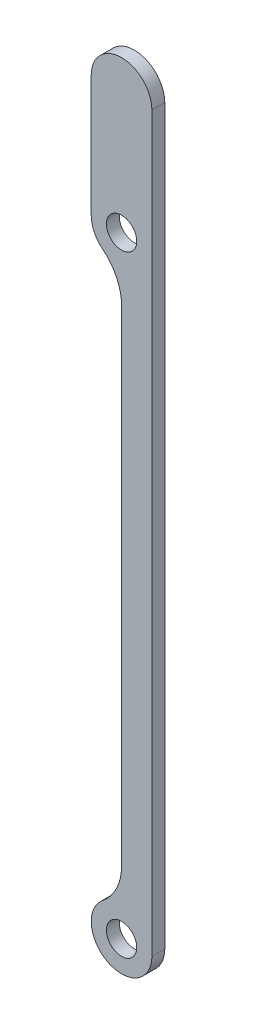
ISO-10303-21;
HEADER;
FILE_DESCRIPTION(('STEP AP214'),'2;1');
FILE_NAME('part.step','',(''),(''),'','','');
FILE_SCHEMA(('AUTOMOTIVE_DESIGN { 1 0 10303 214 1 1 1 1 }'));
ENDSEC;
DATA;
#1=APPLICATION_CONTEXT('core data for automotive mechanical design processes');
#2=APPLICATION_PROTOCOL_DEFINITION('international standard','automotive_design',2000,#1);
#3=PRODUCT_CONTEXT('',#1,'mechanical');
#4=PRODUCT('Part','Part','',(#3));
#5=PRODUCT_RELATED_PRODUCT_CATEGORY('part','',(#4));
#6=PRODUCT_DEFINITION_FORMATION('','',#4);
#7=PRODUCT_DEFINITION_CONTEXT('part definition',#1,'design');
#8=PRODUCT_DEFINITION('design','',#6,#7);
#9=PRODUCT_DEFINITION_SHAPE('','',#8);
#10=(LENGTH_UNIT() NAMED_UNIT(*) SI_UNIT(.MILLI.,.METRE.));
#11=(NAMED_UNIT(*) PLANE_ANGLE_UNIT() SI_UNIT($,.RADIAN.));
#12=(NAMED_UNIT(*) SI_UNIT($,.STERADIAN.) SOLID_ANGLE_UNIT());
#13=UNCERTAINTY_MEASURE_WITH_UNIT(LENGTH_MEASURE(1.E-05),#10,'distance_accuracy_value','');
#14=(GEOMETRIC_REPRESENTATION_CONTEXT(3) GLOBAL_UNCERTAINTY_ASSIGNED_CONTEXT((#13)) GLOBAL_UNIT_ASSIGNED_CONTEXT((#10,
#11,#12)) REPRESENTATION_CONTEXT('',''));
#15=CARTESIAN_POINT('',(0.,0.,0.));
#16=DIRECTION('',(0.,0.,1.));
#17=DIRECTION('',(1.,0.,0.));
#18=AXIS2_PLACEMENT_3D('',#15,#16,#17);
#19=CARTESIAN_POINT('',(-10.,12.4899959967968,2.55));
#20=DIRECTION('',(0.,0.,-1.));
#21=DIRECTION('',(-1.,0.,0.));
#22=AXIS2_PLACEMENT_3D('',#19,#20,#21);
#23=PLANE('',#22);
#24=CARTESIAN_POINT('',(0.,0.,2.55));
#25=DIRECTION('',(0.,0.,1.));
#26=DIRECTION('',(1.,0.,0.));
#27=AXIS2_PLACEMENT_3D('',#24,#25,#26);
#28=CIRCLE('',#27,3.);
#29=CARTESIAN_POINT('',(3.,0.,2.55));
#30=VERTEX_POINT('',#29);
#31=EDGE_CURVE('E136',#30,#30,#28,.T.);
#32=ORIENTED_EDGE('',*,*,#31,.F.);
#33=EDGE_LOOP('',(#32));
#34=FACE_BOUND('',#33,.T.);
#35=CARTESIAN_POINT('',(-10.,12.4899959967968,2.55));
#36=DIRECTION('',(0.,0.,-1.));
#37=DIRECTION('',(-1.,0.,0.));
#38=AXIS2_PLACEMENT_3D('',#35,#36,#37);
#39=CIRCLE('',#38,10.);
#40=CARTESIAN_POINT('',(0.,12.4899959967968,2.55));
#41=VERTEX_POINT('',#40);
#42=CARTESIAN_POINT('',(-3.75,4.6837484987988,2.55));
#43=VERTEX_POINT('',#42);
#44=EDGE_CURVE('E148',#41,#43,#39,.T.);
#45=ORIENTED_EDGE('',*,*,#44,.T.);
#46=CARTESIAN_POINT('',(0.,0.,2.55));
#47=DIRECTION('',(0.,0.,1.));
#48=DIRECTION('',(1.,0.,0.));
#49=AXIS2_PLACEMENT_3D('',#46,#47,#48);
#50=CIRCLE('',#49,6.);
#51=CARTESIAN_POINT('',(6.,0.,2.55));
#52=VERTEX_POINT('',#51);
#53=EDGE_CURVE('E95',#43,#52,#50,.T.);
#54=ORIENTED_EDGE('',*,*,#53,.T.);
#55=DIRECTION('',(0.,1.,0.));
#56=VECTOR('',#55,1.);
#57=CARTESIAN_POINT('',(5.99999999999998,120.,2.55));
#58=LINE('',#57,#56);
#59=CARTESIAN_POINT('',(5.99999999999998,145.,2.55));
#60=VERTEX_POINT('',#59);
#61=EDGE_CURVE('E162',#52,#60,#58,.T.);
#62=ORIENTED_EDGE('',*,*,#61,.T.);
#63=CARTESIAN_POINT('',(0.,145.,2.55));
#64=DIRECTION('',(0.,0.,1.));
#65=DIRECTION('',(1.,0.,0.));
#66=AXIS2_PLACEMENT_3D('',#63,#64,#65);
#67=CIRCLE('',#66,6.);
#68=CARTESIAN_POINT('',(-6.00000000000001,145.,2.55));
#69=VERTEX_POINT('',#68);
#70=EDGE_CURVE('E177',#60,#69,#67,.T.);
#71=ORIENTED_EDGE('',*,*,#70,.T.);
#72=DIRECTION('',(0.,-1.,0.));
#73=VECTOR('',#72,1.);
#74=CARTESIAN_POINT('',(-6.00000000000001,145.,2.55));
#75=LINE('',#74,#73);
#76=CARTESIAN_POINT('',(-6.00000000000001,121.,2.55));
#77=VERTEX_POINT('',#76);
#78=EDGE_CURVE('E114',#69,#77,#75,.T.);
#79=ORIENTED_EDGE('',*,*,#78,.T.);
#80=CARTESIAN_POINT('',(0.,121.,2.55));
#81=DIRECTION('',(0.,0.,1.));
#82=DIRECTION('',(1.,0.,0.));
#83=AXIS2_PLACEMENT_3D('',#80,#81,#82);
#84=CIRCLE('',#83,5.99999999999999);
#85=CARTESIAN_POINT('',(-3.75000000000001,116.316251501201,2.55));
#86=VERTEX_POINT('',#85);
#87=EDGE_CURVE('E108',#77,#86,#84,.T.);
#88=ORIENTED_EDGE('',*,*,#87,.T.);
#89=CARTESIAN_POINT('',(-10.,108.510004003203,2.55));
#90=DIRECTION('',(0.,0.,-1.));
#91=DIRECTION('',(-1.,0.,0.));
#92=AXIS2_PLACEMENT_3D('',#89,#90,#91);
#93=CIRCLE('',#92,10.);
#94=CARTESIAN_POINT('',(0.,108.510004003203,2.55));
#95=VERTEX_POINT('',#94);
#96=EDGE_CURVE('E112',#86,#95,#93,.T.);
#97=ORIENTED_EDGE('',*,*,#96,.T.);
#98=DIRECTION('',(0.,-1.,0.));
#99=VECTOR('',#98,1.);
#100=CARTESIAN_POINT('',(0.,12.4899959967968,2.55));
#101=LINE('',#100,#99);
#102=EDGE_CURVE('E52',#95,#41,#101,.T.);
#103=ORIENTED_EDGE('',*,*,#102,.T.);
#104=EDGE_LOOP('',(#45,#54,#62,#71,#79,#88,#97,#103));
#105=FACE_BOUND('',#104,.T.);
#106=CARTESIAN_POINT('',(0.,121.,2.55));
#107=DIRECTION('',(0.,0.,1.));
#108=DIRECTION('',(1.,0.,0.));
#109=AXIS2_PLACEMENT_3D('',#106,#107,#108);
#110=CIRCLE('',#109,3.);
#111=CARTESIAN_POINT('',(2.99999999999999,121.,2.55));
#112=VERTEX_POINT('',#111);
#113=EDGE_CURVE('E186',#112,#112,#110,.T.);
#114=ORIENTED_EDGE('',*,*,#113,.F.);
#115=EDGE_LOOP('',(#114));
#116=FACE_BOUND('',#115,.T.);
#117=ADVANCED_FACE('F35',(#34,#105,#116),#23,.F.);
#118=CARTESIAN_POINT('',(-10.,12.4899959967968,0.));
#119=DIRECTION('',(0.,0.,-1.));
#120=DIRECTION('',(-1.,0.,0.));
#121=AXIS2_PLACEMENT_3D('',#118,#119,#120);
#122=PLANE('',#121);
#123=CARTESIAN_POINT('',(0.,0.,0.));
#124=DIRECTION('',(0.,0.,1.));
#125=DIRECTION('',(1.,0.,0.));
#126=AXIS2_PLACEMENT_3D('',#123,#124,#125);
#127=CIRCLE('',#126,3.);
#128=CARTESIAN_POINT('',(3.,0.,0.));
#129=VERTEX_POINT('',#128);
#130=EDGE_CURVE('E183',#129,#129,#127,.T.);
#131=ORIENTED_EDGE('',*,*,#130,.T.);
#132=EDGE_LOOP('',(#131));
#133=FACE_BOUND('',#132,.T.);
#134=CARTESIAN_POINT('',(-10.,12.4899959967968,0.));
#135=DIRECTION('',(0.,0.,-1.));
#136=DIRECTION('',(-1.,0.,0.));
#137=AXIS2_PLACEMENT_3D('',#134,#135,#136);
#138=CIRCLE('',#137,10.);
#139=CARTESIAN_POINT('',(0.,12.4899959967968,0.));
#140=VERTEX_POINT('',#139);
#141=CARTESIAN_POINT('',(-3.75,4.6837484987988,0.));
#142=VERTEX_POINT('',#141);
#143=EDGE_CURVE('E132',#140,#142,#138,.T.);
#144=ORIENTED_EDGE('',*,*,#143,.F.);
#145=DIRECTION('',(0.,-1.,0.));
#146=VECTOR('',#145,1.);
#147=CARTESIAN_POINT('',(0.,12.4899959967968,0.));
#148=LINE('',#147,#146);
#149=CARTESIAN_POINT('',(0.,108.510004003203,0.));
#150=VERTEX_POINT('',#149);
#151=EDGE_CURVE('E87',#150,#140,#148,.T.);
#152=ORIENTED_EDGE('',*,*,#151,.F.);
#153=CARTESIAN_POINT('',(-10.,108.510004003203,0.));
#154=DIRECTION('',(0.,0.,-1.));
#155=DIRECTION('',(-1.,0.,0.));
#156=AXIS2_PLACEMENT_3D('',#153,#154,#155);
#157=CIRCLE('',#156,10.);
#158=CARTESIAN_POINT('',(-3.75000000000001,116.316251501201,0.));
#159=VERTEX_POINT('',#158);
#160=EDGE_CURVE('E81',#159,#150,#157,.T.);
#161=ORIENTED_EDGE('',*,*,#160,.F.);
#162=CARTESIAN_POINT('',(0.,121.,0.));
#163=DIRECTION('',(0.,0.,1.));
#164=DIRECTION('',(1.,0.,0.));
#165=AXIS2_PLACEMENT_3D('',#162,#163,#164);
#166=CIRCLE('',#165,5.99999999999999);
#167=CARTESIAN_POINT('',(-6.00000000000001,121.,0.));
#168=VERTEX_POINT('',#167);
#169=EDGE_CURVE('E122',#168,#159,#166,.T.);
#170=ORIENTED_EDGE('',*,*,#169,.F.);
#171=DIRECTION('',(0.,-1.,0.));
#172=VECTOR('',#171,1.);
#173=CARTESIAN_POINT('',(-6.00000000000001,145.,0.));
#174=LINE('',#173,#172);
#175=CARTESIAN_POINT('',(-6.00000000000001,145.,0.));
#176=VERTEX_POINT('',#175);
#177=EDGE_CURVE('E143',#176,#168,#174,.T.);
#178=ORIENTED_EDGE('',*,*,#177,.F.);
#179=CARTESIAN_POINT('',(0.,145.,0.));
#180=DIRECTION('',(0.,0.,1.));
#181=DIRECTION('',(1.,0.,0.));
#182=AXIS2_PLACEMENT_3D('',#179,#180,#181);
#183=CIRCLE('',#182,6.);
#184=CARTESIAN_POINT('',(5.99999999999998,145.,0.));
#185=VERTEX_POINT('',#184);
#186=EDGE_CURVE('E141',#185,#176,#183,.T.);
#187=ORIENTED_EDGE('',*,*,#186,.F.);
#188=DIRECTION('',(0.,1.,0.));
#189=VECTOR('',#188,1.);
#190=CARTESIAN_POINT('',(5.99999999999998,120.,0.));
#191=LINE('',#190,#189);
#192=CARTESIAN_POINT('',(6.,0.,0.));
#193=VERTEX_POINT('',#192);
#194=EDGE_CURVE('E139',#193,#185,#191,.T.);
#195=ORIENTED_EDGE('',*,*,#194,.F.);
#196=CARTESIAN_POINT('',(0.,0.,0.));
#197=DIRECTION('',(0.,0.,1.));
#198=DIRECTION('',(1.,0.,0.));
#199=AXIS2_PLACEMENT_3D('',#196,#197,#198);
#200=CIRCLE('',#199,6.);
#201=EDGE_CURVE('E135',#142,#193,#200,.T.);
#202=ORIENTED_EDGE('',*,*,#201,.F.);
#203=EDGE_LOOP('',(#144,#152,#161,#170,#178,#187,#195,#202));
#204=FACE_BOUND('',#203,.T.);
#205=CARTESIAN_POINT('',(0.,121.,0.));
#206=DIRECTION('',(0.,0.,1.));
#207=DIRECTION('',(1.,0.,0.));
#208=AXIS2_PLACEMENT_3D('',#205,#206,#207);
#209=CIRCLE('',#208,3.);
#210=CARTESIAN_POINT('',(2.99999999999999,121.,0.));
#211=VERTEX_POINT('',#210);
#212=EDGE_CURVE('E189',#211,#211,#209,.T.);
#213=ORIENTED_EDGE('',*,*,#212,.T.);
#214=EDGE_LOOP('',(#213));
#215=FACE_BOUND('',#214,.T.);
#216=ADVANCED_FACE('F167',(#133,#204,#215),#122,.T.);
#217=CARTESIAN_POINT('',(-10.,12.4899959967968,2.55));
#218=DIRECTION('',(0.,0.,-1.));
#219=DIRECTION('',(-1.,0.,0.));
#220=AXIS2_PLACEMENT_3D('',#217,#218,#219);
#221=CYLINDRICAL_SURFACE('',#220,10.);
#222=ORIENTED_EDGE('',*,*,#143,.T.);
#223=DIRECTION('',(0.,0.,-1.));
#224=VECTOR('',#223,1.);
#225=CARTESIAN_POINT('',(-3.75,4.6837484987988,2.55));
#226=LINE('',#225,#224);
#227=EDGE_CURVE('E11',#43,#142,#226,.T.);
#228=ORIENTED_EDGE('',*,*,#227,.F.);
#229=ORIENTED_EDGE('',*,*,#44,.F.);
#230=DIRECTION('',(0.,0.,-1.));
#231=VECTOR('',#230,1.);
#232=CARTESIAN_POINT('',(0.,12.4899959967968,2.55));
#233=LINE('',#232,#231);
#234=EDGE_CURVE('E128',#41,#140,#233,.T.);
#235=ORIENTED_EDGE('',*,*,#234,.T.);
#236=EDGE_LOOP('',(#222,#228,#229,#235));
#237=FACE_BOUND('',#236,.T.);
#238=ADVANCED_FACE('F37',(#237),#221,.F.);
#239=CARTESIAN_POINT('',(0.,0.,2.55));
#240=DIRECTION('',(0.,0.,-1.));
#241=DIRECTION('',(-1.,0.,0.));
#242=AXIS2_PLACEMENT_3D('',#239,#240,#241);
#243=CYLINDRICAL_SURFACE('',#242,6.);
#244=ORIENTED_EDGE('',*,*,#201,.T.);
#245=DIRECTION('',(0.,0.,-1.));
#246=VECTOR('',#245,1.);
#247=CARTESIAN_POINT('',(6.,0.,2.55));
#248=LINE('',#247,#246);
#249=EDGE_CURVE('E44',#52,#193,#248,.T.);
#250=ORIENTED_EDGE('',*,*,#249,.F.);
#251=ORIENTED_EDGE('',*,*,#53,.F.);
#252=ORIENTED_EDGE('',*,*,#227,.T.);
#253=EDGE_LOOP('',(#244,#250,#251,#252));
#254=FACE_BOUND('',#253,.T.);
#255=ADVANCED_FACE('F163',(#254),#243,.T.);
#256=CARTESIAN_POINT('',(5.99999999999998,120.,2.55));
#257=DIRECTION('',(-1.,0.,0.));
#258=DIRECTION('',(0.,0.,1.));
#259=AXIS2_PLACEMENT_3D('',#256,#257,#258);
#260=PLANE('',#259);
#261=ORIENTED_EDGE('',*,*,#194,.T.);
#262=DIRECTION('',(0.,0.,-1.));
#263=VECTOR('',#262,1.);
#264=CARTESIAN_POINT('',(5.99999999999998,145.,2.55));
#265=LINE('',#264,#263);
#266=EDGE_CURVE('E155',#60,#185,#265,.T.);
#267=ORIENTED_EDGE('',*,*,#266,.F.);
#268=ORIENTED_EDGE('',*,*,#61,.F.);
#269=ORIENTED_EDGE('',*,*,#249,.T.);
#270=EDGE_LOOP('',(#261,#267,#268,#269));
#271=FACE_BOUND('',#270,.T.);
#272=ADVANCED_FACE('F160',(#271),#260,.F.);
#273=CARTESIAN_POINT('',(0.,145.,2.55));
#274=DIRECTION('',(0.,0.,-1.));
#275=DIRECTION('',(-1.,0.,0.));
#276=AXIS2_PLACEMENT_3D('',#273,#274,#275);
#277=CYLINDRICAL_SURFACE('',#276,6.);
#278=ORIENTED_EDGE('',*,*,#186,.T.);
#279=DIRECTION('',(0.,0.,-1.));
#280=VECTOR('',#279,1.);
#281=CARTESIAN_POINT('',(-6.00000000000001,145.,2.55));
#282=LINE('',#281,#280);
#283=EDGE_CURVE('E152',#69,#176,#282,.T.);
#284=ORIENTED_EDGE('',*,*,#283,.F.);
#285=ORIENTED_EDGE('',*,*,#70,.F.);
#286=ORIENTED_EDGE('',*,*,#266,.T.);
#287=EDGE_LOOP('',(#278,#284,#285,#286));
#288=FACE_BOUND('',#287,.T.);
#289=ADVANCED_FACE('F173',(#288),#277,.T.);
#290=CARTESIAN_POINT('',(-6.00000000000001,145.,2.55));
#291=DIRECTION('',(1.,0.,0.));
#292=DIRECTION('',(0.,1.,0.));
#293=AXIS2_PLACEMENT_3D('',#290,#291,#292);
#294=PLANE('',#293);
#295=ORIENTED_EDGE('',*,*,#177,.T.);
#296=DIRECTION('',(0.,0.,-1.));
#297=VECTOR('',#296,1.);
#298=CARTESIAN_POINT('',(-6.00000000000001,121.,2.55));
#299=LINE('',#298,#297);
#300=EDGE_CURVE('E123',#77,#168,#299,.T.);
#301=ORIENTED_EDGE('',*,*,#300,.F.);
#302=ORIENTED_EDGE('',*,*,#78,.F.);
#303=ORIENTED_EDGE('',*,*,#283,.T.);
#304=EDGE_LOOP('',(#295,#301,#302,#303));
#305=FACE_BOUND('',#304,.T.);
#306=ADVANCED_FACE('F176',(#305),#294,.F.);
#307=CARTESIAN_POINT('',(0.,121.,2.55));
#308=DIRECTION('',(0.,0.,-1.));
#309=DIRECTION('',(-1.,0.,0.));
#310=AXIS2_PLACEMENT_3D('',#307,#308,#309);
#311=CYLINDRICAL_SURFACE('',#310,5.99999999999999);
#312=ORIENTED_EDGE('',*,*,#169,.T.);
#313=DIRECTION('',(0.,0.,-1.));
#314=VECTOR('',#313,1.);
#315=CARTESIAN_POINT('',(-3.75000000000001,116.316251501201,2.55));
#316=LINE('',#315,#314);
#317=EDGE_CURVE('E119',#86,#159,#316,.T.);
#318=ORIENTED_EDGE('',*,*,#317,.F.);
#319=ORIENTED_EDGE('',*,*,#87,.F.);
#320=ORIENTED_EDGE('',*,*,#300,.T.);
#321=EDGE_LOOP('',(#312,#318,#319,#320));
#322=FACE_BOUND('',#321,.T.);
#323=ADVANCED_FACE('F120',(#322),#311,.T.);
#324=CARTESIAN_POINT('',(-10.,108.510004003203,2.55));
#325=DIRECTION('',(0.,0.,-1.));
#326=DIRECTION('',(-1.,0.,0.));
#327=AXIS2_PLACEMENT_3D('',#324,#325,#326);
#328=CYLINDRICAL_SURFACE('',#327,10.);
#329=ORIENTED_EDGE('',*,*,#160,.T.);
#330=DIRECTION('',(0.,0.,-1.));
#331=VECTOR('',#330,1.);
#332=CARTESIAN_POINT('',(0.,108.510004003203,2.55));
#333=LINE('',#332,#331);
#334=EDGE_CURVE('E124',#95,#150,#333,.T.);
#335=ORIENTED_EDGE('',*,*,#334,.F.);
#336=ORIENTED_EDGE('',*,*,#96,.F.);
#337=ORIENTED_EDGE('',*,*,#317,.T.);
#338=EDGE_LOOP('',(#329,#335,#336,#337));
#339=FACE_BOUND('',#338,.T.);
#340=ADVANCED_FACE('F126',(#339),#328,.F.);
#341=CARTESIAN_POINT('',(0.,12.4899959967968,2.55));
#342=DIRECTION('',(1.,0.,0.));
#343=DIRECTION('',(0.,1.,0.));
#344=AXIS2_PLACEMENT_3D('',#341,#342,#343);
#345=PLANE('',#344);
#346=ORIENTED_EDGE('',*,*,#151,.T.);
#347=ORIENTED_EDGE('',*,*,#234,.F.);
#348=ORIENTED_EDGE('',*,*,#102,.F.);
#349=ORIENTED_EDGE('',*,*,#334,.T.);
#350=EDGE_LOOP('',(#346,#347,#348,#349));
#351=FACE_BOUND('',#350,.T.);
#352=ADVANCED_FACE('F210',(#351),#345,.F.);
#353=CARTESIAN_POINT('',(0.,0.,2.55));
#354=DIRECTION('',(0.,0.,-1.));
#355=DIRECTION('',(-1.,0.,0.));
#356=AXIS2_PLACEMENT_3D('',#353,#354,#355);
#357=CYLINDRICAL_SURFACE('',#356,3.);
#358=ORIENTED_EDGE('',*,*,#31,.T.);
#359=EDGE_LOOP('',(#358));
#360=FACE_BOUND('',#359,.T.);
#361=ORIENTED_EDGE('',*,*,#130,.F.);
#362=EDGE_LOOP('',(#361));
#363=FACE_BOUND('',#362,.T.);
#364=ADVANCED_FACE('F207',(#360,#363),#357,.F.);
#365=CARTESIAN_POINT('',(0.,121.,2.55));
#366=DIRECTION('',(0.,0.,-1.));
#367=DIRECTION('',(-1.,0.,0.));
#368=AXIS2_PLACEMENT_3D('',#365,#366,#367);
#369=CYLINDRICAL_SURFACE('',#368,3.);
#370=ORIENTED_EDGE('',*,*,#113,.T.);
#371=EDGE_LOOP('',(#370));
#372=FACE_BOUND('',#371,.T.);
#373=ORIENTED_EDGE('',*,*,#212,.F.);
#374=EDGE_LOOP('',(#373));
#375=FACE_BOUND('',#374,.T.);
#376=ADVANCED_FACE('F195',(#372,#375),#369,.F.);
#377=CLOSED_SHELL('',(#117,#216,#238,#255,#272,#289,#306,#323,#340,#352,#364,#376));
#378=MANIFOLD_SOLID_BREP('B2',#377);
#379=ADVANCED_BREP_SHAPE_REPRESENTATION('',(#18,#378),#14);
#380=SHAPE_DEFINITION_REPRESENTATION(#9,#379);
ENDSEC;
END-ISO-10303-21;
